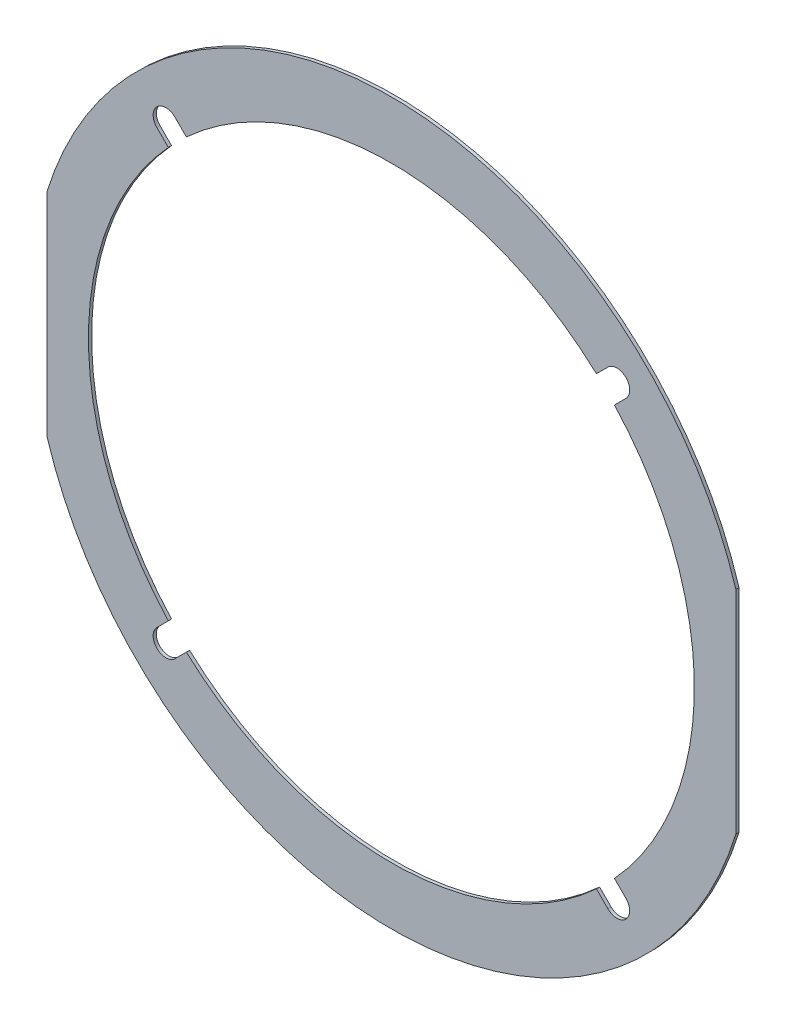
ISO-10303-21;
HEADER;
FILE_DESCRIPTION(('STEP AP214'),'2;1');
FILE_NAME('part.step','',(''),(''),'','','');
FILE_SCHEMA(('AUTOMOTIVE_DESIGN { 1 0 10303 214 1 1 1 1 }'));
ENDSEC;
DATA;
#1=APPLICATION_CONTEXT('core data for automotive mechanical design processes');
#2=APPLICATION_PROTOCOL_DEFINITION('international standard','automotive_design',2000,#1);
#3=PRODUCT_CONTEXT('',#1,'mechanical');
#4=PRODUCT('Part','Part','',(#3));
#5=PRODUCT_RELATED_PRODUCT_CATEGORY('part','',(#4));
#6=PRODUCT_DEFINITION_FORMATION('','',#4);
#7=PRODUCT_DEFINITION_CONTEXT('part definition',#1,'design');
#8=PRODUCT_DEFINITION('design','',#6,#7);
#9=PRODUCT_DEFINITION_SHAPE('','',#8);
#10=(LENGTH_UNIT() NAMED_UNIT(*) SI_UNIT(.MILLI.,.METRE.));
#11=(NAMED_UNIT(*) PLANE_ANGLE_UNIT() SI_UNIT($,.RADIAN.));
#12=(NAMED_UNIT(*) SI_UNIT($,.STERADIAN.) SOLID_ANGLE_UNIT());
#13=UNCERTAINTY_MEASURE_WITH_UNIT(LENGTH_MEASURE(1.E-05),#10,'distance_accuracy_value','');
#14=(GEOMETRIC_REPRESENTATION_CONTEXT(3) GLOBAL_UNCERTAINTY_ASSIGNED_CONTEXT((#13)) GLOBAL_UNIT_ASSIGNED_CONTEXT((#10,
#11,#12)) REPRESENTATION_CONTEXT('',''));
#15=CARTESIAN_POINT('',(0.,0.,0.));
#16=DIRECTION('',(0.,0.,1.));
#17=DIRECTION('',(1.,0.,0.));
#18=AXIS2_PLACEMENT_3D('',#15,#16,#17);
#19=CARTESIAN_POINT('',(-27.,0.,0.25));
#20=DIRECTION('',(1.,0.,0.));
#21=DIRECTION('',(0.,1.,0.));
#22=AXIS2_PLACEMENT_3D('',#19,#20,#21);
#23=PLANE('',#22);
#24=DIRECTION('',(0.,-1.,0.));
#25=VECTOR('',#24,1.);
#26=CARTESIAN_POINT('',(-27.,0.,0.));
#27=LINE('',#26,#25);
#28=CARTESIAN_POINT('',(-27.,8.31038506929737,0.));
#29=VERTEX_POINT('',#28);
#30=CARTESIAN_POINT('',(-27.,-8.31038506929736,0.));
#31=VERTEX_POINT('',#30);
#32=EDGE_CURVE('E268',#29,#31,#27,.T.);
#33=ORIENTED_EDGE('',*,*,#32,.T.);
#34=DIRECTION('',(0.,0.,-1.));
#35=VECTOR('',#34,1.);
#36=CARTESIAN_POINT('',(-27.,-8.31038506929736,0.25));
#37=LINE('',#36,#35);
#38=CARTESIAN_POINT('',(-27.,-8.31038506929736,0.25));
#39=VERTEX_POINT('',#38);
#40=EDGE_CURVE('E11',#39,#31,#37,.T.);
#41=ORIENTED_EDGE('',*,*,#40,.F.);
#42=DIRECTION('',(0.,-1.,0.));
#43=VECTOR('',#42,1.);
#44=CARTESIAN_POINT('',(-27.,0.,0.25));
#45=LINE('',#44,#43);
#46=CARTESIAN_POINT('',(-27.,8.31038506929737,0.25));
#47=VERTEX_POINT('',#46);
#48=EDGE_CURVE('E196',#47,#39,#45,.T.);
#49=ORIENTED_EDGE('',*,*,#48,.F.);
#50=DIRECTION('',(0.,0.,-1.));
#51=VECTOR('',#50,1.);
#52=CARTESIAN_POINT('',(-27.,8.31038506929737,0.25));
#53=LINE('',#52,#51);
#54=EDGE_CURVE('E278',#47,#29,#53,.T.);
#55=ORIENTED_EDGE('',*,*,#54,.T.);
#56=EDGE_LOOP('',(#33,#41,#49,#55));
#57=FACE_BOUND('',#56,.T.);
#58=ADVANCED_FACE('F44',(#57),#23,.F.);
#59=CARTESIAN_POINT('',(0.,0.,0.25));
#60=DIRECTION('',(0.,0.,-1.));
#61=DIRECTION('',(-1.,0.,0.));
#62=AXIS2_PLACEMENT_3D('',#59,#60,#61);
#63=CYLINDRICAL_SURFACE('',#62,28.25);
#64=CARTESIAN_POINT('',(0.,0.,0.));
#65=DIRECTION('',(0.,0.,1.));
#66=DIRECTION('',(1.,0.,0.));
#67=AXIS2_PLACEMENT_3D('',#64,#65,#66);
#68=CIRCLE('',#67,28.25);
#69=CARTESIAN_POINT('',(27.,-8.31038506929733,0.));
#70=VERTEX_POINT('',#69);
#71=EDGE_CURVE('E203',#31,#70,#68,.T.);
#72=ORIENTED_EDGE('',*,*,#71,.T.);
#73=DIRECTION('',(0.,0.,-1.));
#74=VECTOR('',#73,1.);
#75=CARTESIAN_POINT('',(27.,-8.31038506929733,0.25));
#76=LINE('',#75,#74);
#77=CARTESIAN_POINT('',(27.,-8.31038506929733,0.25));
#78=VERTEX_POINT('',#77);
#79=EDGE_CURVE('E57',#78,#70,#76,.T.);
#80=ORIENTED_EDGE('',*,*,#79,.F.);
#81=CARTESIAN_POINT('',(0.,0.,0.25));
#82=DIRECTION('',(0.,0.,1.));
#83=DIRECTION('',(1.,0.,0.));
#84=AXIS2_PLACEMENT_3D('',#81,#82,#83);
#85=CIRCLE('',#84,28.25);
#86=EDGE_CURVE('E194',#39,#78,#85,.T.);
#87=ORIENTED_EDGE('',*,*,#86,.F.);
#88=ORIENTED_EDGE('',*,*,#40,.T.);
#89=EDGE_LOOP('',(#72,#80,#87,#88));
#90=FACE_BOUND('',#89,.T.);
#91=ADVANCED_FACE('F204',(#90),#63,.T.);
#92=CARTESIAN_POINT('',(27.,0.,0.25));
#93=DIRECTION('',(-1.,0.,0.));
#94=DIRECTION('',(0.,0.,1.));
#95=AXIS2_PLACEMENT_3D('',#92,#93,#94);
#96=PLANE('',#95);
#97=DIRECTION('',(0.,1.,0.));
#98=VECTOR('',#97,1.);
#99=CARTESIAN_POINT('',(27.,0.,0.));
#100=LINE('',#99,#98);
#101=CARTESIAN_POINT('',(27.,8.31038506929733,0.));
#102=VERTEX_POINT('',#101);
#103=EDGE_CURVE('E127',#70,#102,#100,.T.);
#104=ORIENTED_EDGE('',*,*,#103,.T.);
#105=DIRECTION('',(0.,0.,-1.));
#106=VECTOR('',#105,1.);
#107=CARTESIAN_POINT('',(27.,8.31038506929733,0.25));
#108=LINE('',#107,#106);
#109=CARTESIAN_POINT('',(27.,8.31038506929733,0.25));
#110=VERTEX_POINT('',#109);
#111=EDGE_CURVE('E209',#110,#102,#108,.T.);
#112=ORIENTED_EDGE('',*,*,#111,.F.);
#113=DIRECTION('',(0.,1.,0.));
#114=VECTOR('',#113,1.);
#115=CARTESIAN_POINT('',(27.,0.,0.25));
#116=LINE('',#115,#114);
#117=EDGE_CURVE('E199',#78,#110,#116,.T.);
#118=ORIENTED_EDGE('',*,*,#117,.F.);
#119=ORIENTED_EDGE('',*,*,#79,.T.);
#120=EDGE_LOOP('',(#104,#112,#118,#119));
#121=FACE_BOUND('',#120,.T.);
#122=ADVANCED_FACE('F206',(#121),#96,.F.);
#123=CARTESIAN_POINT('',(0.,0.,0.25));
#124=DIRECTION('',(0.,0.,-1.));
#125=DIRECTION('',(-1.,0.,0.));
#126=AXIS2_PLACEMENT_3D('',#123,#124,#125);
#127=CYLINDRICAL_SURFACE('',#126,23.75);
#128=CARTESIAN_POINT('',(0.,0.,0.));
#129=DIRECTION('',(0.,0.,1.));
#130=DIRECTION('',(1.,0.,0.));
#131=AXIS2_PLACEMENT_3D('',#128,#129,#130);
#132=CIRCLE('',#131,23.75);
#133=CARTESIAN_POINT('',(16.0717862097114,17.4859997720843,0.));
#134=VERTEX_POINT('',#133);
#135=CARTESIAN_POINT('',(-16.0717862097112,17.4859997720844,0.));
#136=VERTEX_POINT('',#135);
#137=EDGE_CURVE('E220',#134,#136,#132,.T.);
#138=ORIENTED_EDGE('',*,*,#137,.F.);
#139=DIRECTION('',(0.,0.,-1.));
#140=VECTOR('',#139,1.);
#141=CARTESIAN_POINT('',(16.0717862097114,17.4859997720843,0.25));
#142=LINE('',#141,#140);
#143=CARTESIAN_POINT('',(16.0717862097114,17.4859997720843,0.25));
#144=VERTEX_POINT('',#143);
#145=EDGE_CURVE('E47',#144,#134,#142,.T.);
#146=ORIENTED_EDGE('',*,*,#145,.F.);
#147=CARTESIAN_POINT('',(0.,0.,0.25));
#148=DIRECTION('',(0.,0.,1.));
#149=DIRECTION('',(1.,0.,0.));
#150=AXIS2_PLACEMENT_3D('',#147,#148,#149);
#151=CIRCLE('',#150,23.75);
#152=CARTESIAN_POINT('',(-16.0717862097112,17.4859997720844,0.25));
#153=VERTEX_POINT('',#152);
#154=EDGE_CURVE('E277',#144,#153,#151,.T.);
#155=ORIENTED_EDGE('',*,*,#154,.T.);
#156=DIRECTION('',(0.,0.,-1.));
#157=VECTOR('',#156,1.);
#158=CARTESIAN_POINT('',(-16.0717862097112,17.4859997720844,0.25));
#159=LINE('',#158,#157);
#160=EDGE_CURVE('E211',#153,#136,#159,.T.);
#161=ORIENTED_EDGE('',*,*,#160,.T.);
#162=EDGE_LOOP('',(#138,#146,#155,#161));
#163=FACE_BOUND('',#162,.T.);
#164=ADVANCED_FACE('F345',(#163),#127,.F.);
#165=CARTESIAN_POINT('',(-0.707106781186493,0.707106781186498,0.25));
#166=DIRECTION('',(-0.707106781186545,0.70710678118655,0.));
#167=DIRECTION('',(-0.70710678118655,-0.707106781186545,0.));
#168=AXIS2_PLACEMENT_3D('',#165,#166,#167);
#169=PLANE('',#168);
#170=DIRECTION('',(0.70710678118655,0.707106781186545,0.));
#171=VECTOR('',#170,1.);
#172=CARTESIAN_POINT('',(-0.707106781186493,0.707106781186498,0.));
#173=LINE('',#172,#171);
#174=CARTESIAN_POINT('',(16.9705627484773,18.3847763108501,0.));
#175=VERTEX_POINT('',#174);
#176=EDGE_CURVE('E221',#134,#175,#173,.T.);
#177=ORIENTED_EDGE('',*,*,#176,.T.);
#178=DIRECTION('',(0.,0.,-1.));
#179=VECTOR('',#178,1.);
#180=CARTESIAN_POINT('',(16.9705627484773,18.3847763108501,0.25));
#181=LINE('',#180,#179);
#182=CARTESIAN_POINT('',(16.9705627484773,18.3847763108501,0.25));
#183=VERTEX_POINT('',#182);
#184=EDGE_CURVE('E330',#183,#175,#181,.T.);
#185=ORIENTED_EDGE('',*,*,#184,.F.);
#186=DIRECTION('',(0.70710678118655,0.707106781186545,0.));
#187=VECTOR('',#186,1.);
#188=CARTESIAN_POINT('',(-0.707106781186493,0.707106781186498,0.25));
#189=LINE('',#188,#187);
#190=EDGE_CURVE('E340',#144,#183,#189,.T.);
#191=ORIENTED_EDGE('',*,*,#190,.F.);
#192=ORIENTED_EDGE('',*,*,#145,.T.);
#193=EDGE_LOOP('',(#177,#185,#191,#192));
#194=FACE_BOUND('',#193,.T.);
#195=ADVANCED_FACE('F50',(#194),#169,.F.);
#196=CARTESIAN_POINT('',(17.6776695296638,17.6776695296635,0.25));
#197=DIRECTION('',(0.,0.,-1.));
#198=DIRECTION('',(-1.,0.,0.));
#199=AXIS2_PLACEMENT_3D('',#196,#197,#198);
#200=CYLINDRICAL_SURFACE('',#199,1.00000000000001);
#201=CARTESIAN_POINT('',(17.6776695296638,17.6776695296635,0.));
#202=DIRECTION('',(0.,0.,1.));
#203=DIRECTION('',(1.,0.,0.));
#204=AXIS2_PLACEMENT_3D('',#201,#202,#203);
#205=CIRCLE('',#204,1.00000000000001);
#206=CARTESIAN_POINT('',(18.3847763108504,16.970562748477,0.));
#207=VERTEX_POINT('',#206);
#208=EDGE_CURVE('E226',#175,#207,#205,.F.);
#209=ORIENTED_EDGE('',*,*,#208,.T.);
#210=DIRECTION('',(0.,0.,-1.));
#211=VECTOR('',#210,1.);
#212=CARTESIAN_POINT('',(18.3847763108504,16.970562748477,0.25));
#213=LINE('',#212,#211);
#214=CARTESIAN_POINT('',(18.3847763108504,16.970562748477,0.25));
#215=VERTEX_POINT('',#214);
#216=EDGE_CURVE('E324',#215,#207,#213,.T.);
#217=ORIENTED_EDGE('',*,*,#216,.F.);
#218=CARTESIAN_POINT('',(17.6776695296638,17.6776695296635,0.25));
#219=DIRECTION('',(0.,0.,1.));
#220=DIRECTION('',(1.,0.,0.));
#221=AXIS2_PLACEMENT_3D('',#218,#219,#220);
#222=CIRCLE('',#221,1.00000000000001);
#223=EDGE_CURVE('E484',#183,#215,#222,.F.);
#224=ORIENTED_EDGE('',*,*,#223,.F.);
#225=ORIENTED_EDGE('',*,*,#184,.T.);
#226=EDGE_LOOP('',(#209,#217,#224,#225));
#227=FACE_BOUND('',#226,.T.);
#228=ADVANCED_FACE('F392',(#227),#200,.F.);
#229=CARTESIAN_POINT('',(0.707106781186461,-0.707106781186478,0.25));
#230=DIRECTION('',(-0.707106781186539,0.707106781186556,0.));
#231=DIRECTION('',(-0.707106781186556,-0.707106781186539,0.));
#232=AXIS2_PLACEMENT_3D('',#229,#230,#231);
#233=PLANE('',#232);
#234=DIRECTION('',(0.707106781186556,0.707106781186539,0.));
#235=VECTOR('',#234,1.);
#236=CARTESIAN_POINT('',(0.707106781186461,-0.707106781186478,0.));
#237=LINE('',#236,#235);
#238=CARTESIAN_POINT('',(17.4859997720845,16.0717862097111,0.));
#239=VERTEX_POINT('',#238);
#240=EDGE_CURVE('E229',#239,#207,#237,.T.);
#241=ORIENTED_EDGE('',*,*,#240,.F.);
#242=DIRECTION('',(0.,0.,-1.));
#243=VECTOR('',#242,1.);
#244=CARTESIAN_POINT('',(17.4859997720845,16.0717862097111,0.25));
#245=LINE('',#244,#243);
#246=CARTESIAN_POINT('',(17.4859997720845,16.0717862097111,0.25));
#247=VERTEX_POINT('',#246);
#248=EDGE_CURVE('E325',#247,#239,#245,.T.);
#249=ORIENTED_EDGE('',*,*,#248,.F.);
#250=DIRECTION('',(0.707106781186556,0.707106781186539,0.));
#251=VECTOR('',#250,1.);
#252=CARTESIAN_POINT('',(0.707106781186461,-0.707106781186478,0.25));
#253=LINE('',#252,#251);
#254=EDGE_CURVE('E393',#247,#215,#253,.T.);
#255=ORIENTED_EDGE('',*,*,#254,.T.);
#256=ORIENTED_EDGE('',*,*,#216,.T.);
#257=EDGE_LOOP('',(#241,#249,#255,#256));
#258=FACE_BOUND('',#257,.T.);
#259=ADVANCED_FACE('F386',(#258),#233,.T.);
#260=CARTESIAN_POINT('',(17.4859997720842,-16.0717862097115,0.));
#261=VERTEX_POINT('',#260);
#262=EDGE_CURVE('E223',#261,#239,#132,.T.);
#263=ORIENTED_EDGE('',*,*,#262,.F.);
#264=DIRECTION('',(0.,0.,-1.));
#265=VECTOR('',#264,1.);
#266=CARTESIAN_POINT('',(17.4859997720842,-16.0717862097115,0.25));
#267=LINE('',#266,#265);
#268=CARTESIAN_POINT('',(17.4859997720842,-16.0717862097115,0.25));
#269=VERTEX_POINT('',#268);
#270=EDGE_CURVE('E317',#269,#261,#267,.T.);
#271=ORIENTED_EDGE('',*,*,#270,.F.);
#272=EDGE_CURVE('E383',#269,#247,#151,.T.);
#273=ORIENTED_EDGE('',*,*,#272,.T.);
#274=ORIENTED_EDGE('',*,*,#248,.T.);
#275=EDGE_LOOP('',(#263,#271,#273,#274));
#276=FACE_BOUND('',#275,.T.);
#277=ADVANCED_FACE('F382',(#276),#127,.F.);
#278=CARTESIAN_POINT('',(0.707106781186471,0.707106781186463,0.25));
#279=DIRECTION('',(0.707106781186552,0.707106781186544,0.));
#280=DIRECTION('',(-0.707106781186544,0.707106781186552,0.));
#281=AXIS2_PLACEMENT_3D('',#278,#279,#280);
#282=PLANE('',#281);
#283=DIRECTION('',(0.707106781186544,-0.707106781186552,0.));
#284=VECTOR('',#283,1.);
#285=CARTESIAN_POINT('',(0.707106781186471,0.707106781186463,0.));
#286=LINE('',#285,#284);
#287=CARTESIAN_POINT('',(18.3847763108501,-16.9705627484773,0.));
#288=VERTEX_POINT('',#287);
#289=EDGE_CURVE('E233',#261,#288,#286,.T.);
#290=ORIENTED_EDGE('',*,*,#289,.T.);
#291=DIRECTION('',(0.,0.,-1.));
#292=VECTOR('',#291,1.);
#293=CARTESIAN_POINT('',(18.3847763108501,-16.9705627484773,0.25));
#294=LINE('',#293,#292);
#295=CARTESIAN_POINT('',(18.3847763108501,-16.9705627484773,0.25));
#296=VERTEX_POINT('',#295);
#297=EDGE_CURVE('E314',#296,#288,#294,.T.);
#298=ORIENTED_EDGE('',*,*,#297,.F.);
#299=DIRECTION('',(0.707106781186544,-0.707106781186552,0.));
#300=VECTOR('',#299,1.);
#301=CARTESIAN_POINT('',(0.707106781186471,0.707106781186463,0.25));
#302=LINE('',#301,#300);
#303=EDGE_CURVE('E465',#269,#296,#302,.T.);
#304=ORIENTED_EDGE('',*,*,#303,.F.);
#305=ORIENTED_EDGE('',*,*,#270,.T.);
#306=EDGE_LOOP('',(#290,#298,#304,#305));
#307=FACE_BOUND('',#306,.T.);
#308=ADVANCED_FACE('F437',(#307),#282,.F.);
#309=CARTESIAN_POINT('',(17.6776695296635,-17.6776695296639,0.25));
#310=DIRECTION('',(0.,0.,-1.));
#311=DIRECTION('',(-1.,0.,0.));
#312=AXIS2_PLACEMENT_3D('',#309,#310,#311);
#313=CYLINDRICAL_SURFACE('',#312,1.00000000000001);
#314=CARTESIAN_POINT('',(17.6776695296635,-17.6776695296639,0.));
#315=DIRECTION('',(0.,0.,1.));
#316=DIRECTION('',(1.,0.,0.));
#317=AXIS2_PLACEMENT_3D('',#314,#315,#316);
#318=CIRCLE('',#317,1.00000000000001);
#319=CARTESIAN_POINT('',(16.9705627484769,-18.3847763108504,0.));
#320=VERTEX_POINT('',#319);
#321=EDGE_CURVE('E240',#288,#320,#318,.F.);
#322=ORIENTED_EDGE('',*,*,#321,.T.);
#323=DIRECTION('',(0.,0.,-1.));
#324=VECTOR('',#323,1.);
#325=CARTESIAN_POINT('',(16.9705627484769,-18.3847763108504,0.25));
#326=LINE('',#325,#324);
#327=CARTESIAN_POINT('',(16.9705627484769,-18.3847763108504,0.25));
#328=VERTEX_POINT('',#327);
#329=EDGE_CURVE('E315',#328,#320,#326,.T.);
#330=ORIENTED_EDGE('',*,*,#329,.F.);
#331=CARTESIAN_POINT('',(17.6776695296635,-17.6776695296639,0.25));
#332=DIRECTION('',(0.,0.,1.));
#333=DIRECTION('',(1.,0.,0.));
#334=AXIS2_PLACEMENT_3D('',#331,#332,#333);
#335=CIRCLE('',#334,1.00000000000001);
#336=EDGE_CURVE('E450',#296,#328,#335,.F.);
#337=ORIENTED_EDGE('',*,*,#336,.F.);
#338=ORIENTED_EDGE('',*,*,#297,.T.);
#339=EDGE_LOOP('',(#322,#330,#337,#338));
#340=FACE_BOUND('',#339,.T.);
#341=ADVANCED_FACE('F435',(#340),#313,.F.);
#342=CARTESIAN_POINT('',(-0.707106781186509,-0.70710678118649,0.25));
#343=DIRECTION('',(0.707106781186557,0.707106781186538,0.));
#344=DIRECTION('',(-0.707106781186538,0.707106781186557,0.));
#345=AXIS2_PLACEMENT_3D('',#342,#343,#344);
#346=PLANE('',#345);
#347=DIRECTION('',(0.707106781186538,-0.707106781186557,0.));
#348=VECTOR('',#347,1.);
#349=CARTESIAN_POINT('',(-0.707106781186509,-0.70710678118649,0.));
#350=LINE('',#349,#348);
#351=CARTESIAN_POINT('',(16.0717862097111,-17.4859997720845,0.));
#352=VERTEX_POINT('',#351);
#353=EDGE_CURVE('E242',#352,#320,#350,.T.);
#354=ORIENTED_EDGE('',*,*,#353,.F.);
#355=DIRECTION('',(0.,0.,-1.));
#356=VECTOR('',#355,1.);
#357=CARTESIAN_POINT('',(16.0717862097111,-17.4859997720845,0.25));
#358=LINE('',#357,#356);
#359=CARTESIAN_POINT('',(16.0717862097111,-17.4859997720845,0.25));
#360=VERTEX_POINT('',#359);
#361=EDGE_CURVE('E309',#360,#352,#358,.T.);
#362=ORIENTED_EDGE('',*,*,#361,.F.);
#363=DIRECTION('',(0.707106781186538,-0.707106781186557,0.));
#364=VECTOR('',#363,1.);
#365=CARTESIAN_POINT('',(-0.707106781186509,-0.70710678118649,0.25));
#366=LINE('',#365,#364);
#367=EDGE_CURVE('E451',#360,#328,#366,.T.);
#368=ORIENTED_EDGE('',*,*,#367,.T.);
#369=ORIENTED_EDGE('',*,*,#329,.T.);
#370=EDGE_LOOP('',(#354,#362,#368,#369));
#371=FACE_BOUND('',#370,.T.);
#372=ADVANCED_FACE('F428',(#371),#346,.T.);
#373=CARTESIAN_POINT('',(-16.0717862097113,-17.4859997720844,0.));
#374=VERTEX_POINT('',#373);
#375=EDGE_CURVE('E243',#374,#352,#132,.T.);
#376=ORIENTED_EDGE('',*,*,#375,.F.);
#377=DIRECTION('',(0.,0.,-1.));
#378=VECTOR('',#377,1.);
#379=CARTESIAN_POINT('',(-16.0717862097113,-17.4859997720844,0.25));
#380=LINE('',#379,#378);
#381=CARTESIAN_POINT('',(-16.0717862097113,-17.4859997720844,0.25));
#382=VERTEX_POINT('',#381);
#383=EDGE_CURVE('E308',#382,#374,#380,.T.);
#384=ORIENTED_EDGE('',*,*,#383,.F.);
#385=EDGE_CURVE('E456',#382,#360,#151,.T.);
#386=ORIENTED_EDGE('',*,*,#385,.T.);
#387=ORIENTED_EDGE('',*,*,#361,.T.);
#388=EDGE_LOOP('',(#376,#384,#386,#387));
#389=FACE_BOUND('',#388,.T.);
#390=ADVANCED_FACE('F419',(#389),#127,.F.);
#391=CARTESIAN_POINT('',(0.707106781186488,-0.707106781186483,0.25));
#392=DIRECTION('',(0.70710678118655,-0.707106781186545,0.));
#393=DIRECTION('',(0.707106781186545,0.70710678118655,0.));
#394=AXIS2_PLACEMENT_3D('',#391,#392,#393);
#395=PLANE('',#394);
#396=DIRECTION('',(-0.707106781186545,-0.70710678118655,0.));
#397=VECTOR('',#396,1.);
#398=CARTESIAN_POINT('',(0.707106781186488,-0.707106781186483,0.));
#399=LINE('',#398,#397);
#400=CARTESIAN_POINT('',(-16.9705627484771,-18.3847763108502,0.));
#401=VERTEX_POINT('',#400);
#402=EDGE_CURVE('E247',#374,#401,#399,.T.);
#403=ORIENTED_EDGE('',*,*,#402,.T.);
#404=DIRECTION('',(0.,0.,-1.));
#405=VECTOR('',#404,1.);
#406=CARTESIAN_POINT('',(-16.9705627484771,-18.3847763108502,0.25));
#407=LINE('',#406,#405);
#408=CARTESIAN_POINT('',(-16.9705627484771,-18.3847763108502,0.25));
#409=VERTEX_POINT('',#408);
#410=EDGE_CURVE('E302',#409,#401,#407,.T.);
#411=ORIENTED_EDGE('',*,*,#410,.F.);
#412=DIRECTION('',(-0.707106781186545,-0.70710678118655,0.));
#413=VECTOR('',#412,1.);
#414=CARTESIAN_POINT('',(0.707106781186488,-0.707106781186483,0.25));
#415=LINE('',#414,#413);
#416=EDGE_CURVE('E459',#382,#409,#415,.T.);
#417=ORIENTED_EDGE('',*,*,#416,.F.);
#418=ORIENTED_EDGE('',*,*,#383,.T.);
#419=EDGE_LOOP('',(#403,#411,#417,#418));
#420=FACE_BOUND('',#419,.T.);
#421=ADVANCED_FACE('F423',(#420),#395,.F.);
#422=CARTESIAN_POINT('',(-17.6776695296637,-17.6776695296637,0.25));
#423=DIRECTION('',(0.,0.,-1.));
#424=DIRECTION('',(-1.,0.,0.));
#425=AXIS2_PLACEMENT_3D('',#422,#423,#424);
#426=CYLINDRICAL_SURFACE('',#425,1.00000000000001);
#427=CARTESIAN_POINT('',(-17.6776695296637,-17.6776695296637,0.));
#428=DIRECTION('',(0.,0.,1.));
#429=DIRECTION('',(1.,0.,0.));
#430=AXIS2_PLACEMENT_3D('',#427,#428,#429);
#431=CIRCLE('',#430,1.00000000000001);
#432=CARTESIAN_POINT('',(-18.3847763108502,-16.9705627484771,0.));
#433=VERTEX_POINT('',#432);
#434=EDGE_CURVE('E249',#401,#433,#431,.F.);
#435=ORIENTED_EDGE('',*,*,#434,.T.);
#436=DIRECTION('',(0.,0.,-1.));
#437=VECTOR('',#436,1.);
#438=CARTESIAN_POINT('',(-18.3847763108502,-16.9705627484771,0.25));
#439=LINE('',#438,#437);
#440=CARTESIAN_POINT('',(-18.3847763108502,-16.9705627484771,0.25));
#441=VERTEX_POINT('',#440);
#442=EDGE_CURVE('E296',#441,#433,#439,.T.);
#443=ORIENTED_EDGE('',*,*,#442,.F.);
#444=CARTESIAN_POINT('',(-17.6776695296637,-17.6776695296637,0.25));
#445=DIRECTION('',(0.,0.,1.));
#446=DIRECTION('',(1.,0.,0.));
#447=AXIS2_PLACEMENT_3D('',#444,#445,#446);
#448=CIRCLE('',#447,1.00000000000001);
#449=EDGE_CURVE('E470',#409,#441,#448,.F.);
#450=ORIENTED_EDGE('',*,*,#449,.F.);
#451=ORIENTED_EDGE('',*,*,#410,.T.);
#452=EDGE_LOOP('',(#435,#443,#450,#451));
#453=FACE_BOUND('',#452,.T.);
#454=ADVANCED_FACE('F422',(#453),#426,.F.);
#455=CARTESIAN_POINT('',(-0.707106781186478,0.707106781186483,0.25));
#456=DIRECTION('',(0.707106781186545,-0.70710678118655,0.));
#457=DIRECTION('',(0.70710678118655,0.707106781186545,0.));
#458=AXIS2_PLACEMENT_3D('',#455,#456,#457);
#459=PLANE('',#458);
#460=DIRECTION('',(-0.70710678118655,-0.707106781186545,0.));
#461=VECTOR('',#460,1.);
#462=CARTESIAN_POINT('',(-0.707106781186478,0.707106781186483,0.));
#463=LINE('',#462,#461);
#464=CARTESIAN_POINT('',(-17.4859997720844,-16.0717862097113,0.));
#465=VERTEX_POINT('',#464);
#466=EDGE_CURVE('E255',#465,#433,#463,.T.);
#467=ORIENTED_EDGE('',*,*,#466,.F.);
#468=DIRECTION('',(0.,0.,-1.));
#469=VECTOR('',#468,1.);
#470=CARTESIAN_POINT('',(-17.4859997720844,-16.0717862097113,0.25));
#471=LINE('',#470,#469);
#472=CARTESIAN_POINT('',(-17.4859997720844,-16.0717862097113,0.25));
#473=VERTEX_POINT('',#472);
#474=EDGE_CURVE('E297',#473,#465,#471,.T.);
#475=ORIENTED_EDGE('',*,*,#474,.F.);
#476=DIRECTION('',(-0.70710678118655,-0.707106781186545,0.));
#477=VECTOR('',#476,1.);
#478=CARTESIAN_POINT('',(-0.707106781186478,0.707106781186483,0.25));
#479=LINE('',#478,#477);
#480=EDGE_CURVE('E472',#473,#441,#479,.T.);
#481=ORIENTED_EDGE('',*,*,#480,.T.);
#482=ORIENTED_EDGE('',*,*,#442,.T.);
#483=EDGE_LOOP('',(#467,#475,#481,#482));
#484=FACE_BOUND('',#483,.T.);
#485=ADVANCED_FACE('F420',(#484),#459,.T.);
#486=CARTESIAN_POINT('',(-17.4859997720843,16.0717862097113,0.));
#487=VERTEX_POINT('',#486);
#488=EDGE_CURVE('E225',#487,#465,#132,.T.);
#489=ORIENTED_EDGE('',*,*,#488,.F.);
#490=DIRECTION('',(0.,0.,-1.));
#491=VECTOR('',#490,1.);
#492=CARTESIAN_POINT('',(-17.4859997720843,16.0717862097113,0.25));
#493=LINE('',#492,#491);
#494=CARTESIAN_POINT('',(-17.4859997720843,16.0717862097113,0.25));
#495=VERTEX_POINT('',#494);
#496=EDGE_CURVE('E291',#495,#487,#493,.T.);
#497=ORIENTED_EDGE('',*,*,#496,.F.);
#498=EDGE_CURVE('E370',#495,#473,#151,.T.);
#499=ORIENTED_EDGE('',*,*,#498,.T.);
#500=ORIENTED_EDGE('',*,*,#474,.T.);
#501=EDGE_LOOP('',(#489,#497,#499,#500));
#502=FACE_BOUND('',#501,.T.);
#503=ADVANCED_FACE('F366',(#502),#127,.F.);
#504=CARTESIAN_POINT('',(-0.707106781186488,-0.707106781186488,0.25));
#505=DIRECTION('',(-0.707106781186547,-0.707106781186547,0.));
#506=DIRECTION('',(0.707106781186548,-0.707106781186548,0.));
#507=AXIS2_PLACEMENT_3D('',#504,#505,#506);
#508=PLANE('',#507);
#509=DIRECTION('',(-0.707106781186548,0.707106781186548,0.));
#510=VECTOR('',#509,1.);
#511=CARTESIAN_POINT('',(-0.707106781186488,-0.707106781186488,0.));
#512=LINE('',#511,#510);
#513=CARTESIAN_POINT('',(-18.3847763108502,16.9705627484772,0.));
#514=VERTEX_POINT('',#513);
#515=EDGE_CURVE('E257',#487,#514,#512,.T.);
#516=ORIENTED_EDGE('',*,*,#515,.T.);
#517=DIRECTION('',(0.,0.,-1.));
#518=VECTOR('',#517,1.);
#519=CARTESIAN_POINT('',(-18.3847763108502,16.9705627484772,0.25));
#520=LINE('',#519,#518);
#521=CARTESIAN_POINT('',(-18.3847763108502,16.9705627484772,0.25));
#522=VERTEX_POINT('',#521);
#523=EDGE_CURVE('E286',#522,#514,#520,.T.);
#524=ORIENTED_EDGE('',*,*,#523,.F.);
#525=DIRECTION('',(-0.707106781186548,0.707106781186548,0.));
#526=VECTOR('',#525,1.);
#527=CARTESIAN_POINT('',(-0.707106781186488,-0.707106781186488,0.25));
#528=LINE('',#527,#526);
#529=EDGE_CURVE('E365',#495,#522,#528,.T.);
#530=ORIENTED_EDGE('',*,*,#529,.F.);
#531=ORIENTED_EDGE('',*,*,#496,.T.);
#532=EDGE_LOOP('',(#516,#524,#530,#531));
#533=FACE_BOUND('',#532,.T.);
#534=ADVANCED_FACE('F361',(#533),#508,.F.);
#535=CARTESIAN_POINT('',(-17.6776695296636,17.6776695296637,0.25));
#536=DIRECTION('',(0.,0.,-1.));
#537=DIRECTION('',(-1.,0.,0.));
#538=AXIS2_PLACEMENT_3D('',#535,#536,#537);
#539=CYLINDRICAL_SURFACE('',#538,1.00000000000001);
#540=CARTESIAN_POINT('',(-17.6776695296636,17.6776695296637,0.));
#541=DIRECTION('',(0.,0.,1.));
#542=DIRECTION('',(1.,0.,0.));
#543=AXIS2_PLACEMENT_3D('',#540,#541,#542);
#544=CIRCLE('',#543,1.00000000000001);
#545=CARTESIAN_POINT('',(-16.9705627484771,18.3847763108503,0.));
#546=VERTEX_POINT('',#545);
#547=EDGE_CURVE('E259',#514,#546,#544,.F.);
#548=ORIENTED_EDGE('',*,*,#547,.T.);
#549=DIRECTION('',(0.,0.,-1.));
#550=VECTOR('',#549,1.);
#551=CARTESIAN_POINT('',(-16.9705627484771,18.3847763108503,0.25));
#552=LINE('',#551,#550);
#553=CARTESIAN_POINT('',(-16.9705627484771,18.3847763108503,0.25));
#554=VERTEX_POINT('',#553);
#555=EDGE_CURVE('E287',#554,#546,#552,.T.);
#556=ORIENTED_EDGE('',*,*,#555,.F.);
#557=CARTESIAN_POINT('',(-17.6776695296636,17.6776695296637,0.25));
#558=DIRECTION('',(0.,0.,1.));
#559=DIRECTION('',(1.,0.,0.));
#560=AXIS2_PLACEMENT_3D('',#557,#558,#559);
#561=CIRCLE('',#560,1.00000000000001);
#562=EDGE_CURVE('E358',#522,#554,#561,.F.);
#563=ORIENTED_EDGE('',*,*,#562,.F.);
#564=ORIENTED_EDGE('',*,*,#523,.T.);
#565=EDGE_LOOP('',(#548,#556,#563,#564));
#566=FACE_BOUND('',#565,.T.);
#567=ADVANCED_FACE('F352',(#566),#539,.F.);
#568=CARTESIAN_POINT('',(0.707106781186485,0.707106781186474,0.25));
#569=DIRECTION('',(-0.707106781186553,-0.707106781186542,0.));
#570=DIRECTION('',(0.707106781186542,-0.707106781186553,0.));
#571=AXIS2_PLACEMENT_3D('',#568,#569,#570);
#572=PLANE('',#571);
#573=DIRECTION('',(-0.707106781186542,0.707106781186553,0.));
#574=VECTOR('',#573,1.);
#575=CARTESIAN_POINT('',(0.707106781186485,0.707106781186474,0.));
#576=LINE('',#575,#574);
#577=EDGE_CURVE('E264',#136,#546,#576,.T.);
#578=ORIENTED_EDGE('',*,*,#577,.F.);
#579=ORIENTED_EDGE('',*,*,#160,.F.);
#580=DIRECTION('',(-0.707106781186542,0.707106781186553,0.));
#581=VECTOR('',#580,1.);
#582=CARTESIAN_POINT('',(0.707106781186485,0.707106781186474,0.25));
#583=LINE('',#582,#581);
#584=EDGE_CURVE('E346',#153,#554,#583,.T.);
#585=ORIENTED_EDGE('',*,*,#584,.T.);
#586=ORIENTED_EDGE('',*,*,#555,.T.);
#587=EDGE_LOOP('',(#578,#579,#585,#586));
#588=FACE_BOUND('',#587,.T.);
#589=ADVANCED_FACE('F347',(#588),#572,.T.);
#590=CARTESIAN_POINT('',(0.,0.,0.25));
#591=DIRECTION('',(0.,0.,-1.));
#592=DIRECTION('',(-1.,0.,0.));
#593=AXIS2_PLACEMENT_3D('',#590,#591,#592);
#594=CYLINDRICAL_SURFACE('',#593,28.25);
#595=CARTESIAN_POINT('',(0.,0.,0.));
#596=DIRECTION('',(0.,0.,1.));
#597=DIRECTION('',(1.,0.,0.));
#598=AXIS2_PLACEMENT_3D('',#595,#596,#597);
#599=CIRCLE('',#598,28.25);
#600=EDGE_CURVE('E136',#102,#29,#599,.T.);
#601=ORIENTED_EDGE('',*,*,#600,.T.);
#602=ORIENTED_EDGE('',*,*,#54,.F.);
#603=CARTESIAN_POINT('',(0.,0.,0.25));
#604=DIRECTION('',(0.,0.,1.));
#605=DIRECTION('',(1.,0.,0.));
#606=AXIS2_PLACEMENT_3D('',#603,#604,#605);
#607=CIRCLE('',#606,28.25);
#608=EDGE_CURVE('E63',#110,#47,#607,.T.);
#609=ORIENTED_EDGE('',*,*,#608,.F.);
#610=ORIENTED_EDGE('',*,*,#111,.T.);
#611=EDGE_LOOP('',(#601,#602,#609,#610));
#612=FACE_BOUND('',#611,.T.);
#613=ADVANCED_FACE('F409',(#612),#594,.T.);
#614=CARTESIAN_POINT('',(0.,0.,0.25));
#615=DIRECTION('',(0.,0.,1.));
#616=DIRECTION('',(1.,0.,0.));
#617=AXIS2_PLACEMENT_3D('',#614,#615,#616);
#618=PLANE('',#617);
#619=ORIENTED_EDGE('',*,*,#154,.F.);
#620=ORIENTED_EDGE('',*,*,#190,.T.);
#621=ORIENTED_EDGE('',*,*,#223,.T.);
#622=ORIENTED_EDGE('',*,*,#254,.F.);
#623=ORIENTED_EDGE('',*,*,#272,.F.);
#624=ORIENTED_EDGE('',*,*,#303,.T.);
#625=ORIENTED_EDGE('',*,*,#336,.T.);
#626=ORIENTED_EDGE('',*,*,#367,.F.);
#627=ORIENTED_EDGE('',*,*,#385,.F.);
#628=ORIENTED_EDGE('',*,*,#416,.T.);
#629=ORIENTED_EDGE('',*,*,#449,.T.);
#630=ORIENTED_EDGE('',*,*,#480,.F.);
#631=ORIENTED_EDGE('',*,*,#498,.F.);
#632=ORIENTED_EDGE('',*,*,#529,.T.);
#633=ORIENTED_EDGE('',*,*,#562,.T.);
#634=ORIENTED_EDGE('',*,*,#584,.F.);
#635=EDGE_LOOP('',(#619,#620,#621,#622,#623,#624,#625,#626,#627,#628,#629,#630,#631,#632,#633,#634));
#636=FACE_BOUND('',#635,.T.);
#637=ORIENTED_EDGE('',*,*,#48,.T.);
#638=ORIENTED_EDGE('',*,*,#86,.T.);
#639=ORIENTED_EDGE('',*,*,#117,.T.);
#640=ORIENTED_EDGE('',*,*,#608,.T.);
#641=EDGE_LOOP('',(#637,#638,#639,#640));
#642=FACE_BOUND('',#641,.T.);
#643=ADVANCED_FACE('F193',(#636,#642),#618,.T.);
#644=CARTESIAN_POINT('',(0.,0.,0.));
#645=DIRECTION('',(0.,0.,1.));
#646=DIRECTION('',(1.,0.,0.));
#647=AXIS2_PLACEMENT_3D('',#644,#645,#646);
#648=PLANE('',#647);
#649=ORIENTED_EDGE('',*,*,#137,.T.);
#650=ORIENTED_EDGE('',*,*,#577,.T.);
#651=ORIENTED_EDGE('',*,*,#547,.F.);
#652=ORIENTED_EDGE('',*,*,#515,.F.);
#653=ORIENTED_EDGE('',*,*,#488,.T.);
#654=ORIENTED_EDGE('',*,*,#466,.T.);
#655=ORIENTED_EDGE('',*,*,#434,.F.);
#656=ORIENTED_EDGE('',*,*,#402,.F.);
#657=ORIENTED_EDGE('',*,*,#375,.T.);
#658=ORIENTED_EDGE('',*,*,#353,.T.);
#659=ORIENTED_EDGE('',*,*,#321,.F.);
#660=ORIENTED_EDGE('',*,*,#289,.F.);
#661=ORIENTED_EDGE('',*,*,#262,.T.);
#662=ORIENTED_EDGE('',*,*,#240,.T.);
#663=ORIENTED_EDGE('',*,*,#208,.F.);
#664=ORIENTED_EDGE('',*,*,#176,.F.);
#665=EDGE_LOOP('',(#649,#650,#651,#652,#653,#654,#655,#656,#657,#658,#659,#660,#661,#662,#663,#664));
#666=FACE_BOUND('',#665,.T.);
#667=ORIENTED_EDGE('',*,*,#32,.F.);
#668=ORIENTED_EDGE('',*,*,#600,.F.);
#669=ORIENTED_EDGE('',*,*,#103,.F.);
#670=ORIENTED_EDGE('',*,*,#71,.F.);
#671=EDGE_LOOP('',(#667,#668,#669,#670));
#672=FACE_BOUND('',#671,.T.);
#673=ADVANCED_FACE('F338',(#666,#672),#648,.F.);
#674=CLOSED_SHELL('',(#58,#91,#122,#164,#195,#228,#259,#277,#308,#341,#372,#390,#421,#454,#485,
#503,#534,#567,#589,#613,#643,#673));
#675=MANIFOLD_SOLID_BREP('B2',#674);
#676=ADVANCED_BREP_SHAPE_REPRESENTATION('',(#18,#675),#14);
#677=SHAPE_DEFINITION_REPRESENTATION(#9,#676);
ENDSEC;
END-ISO-10303-21;
